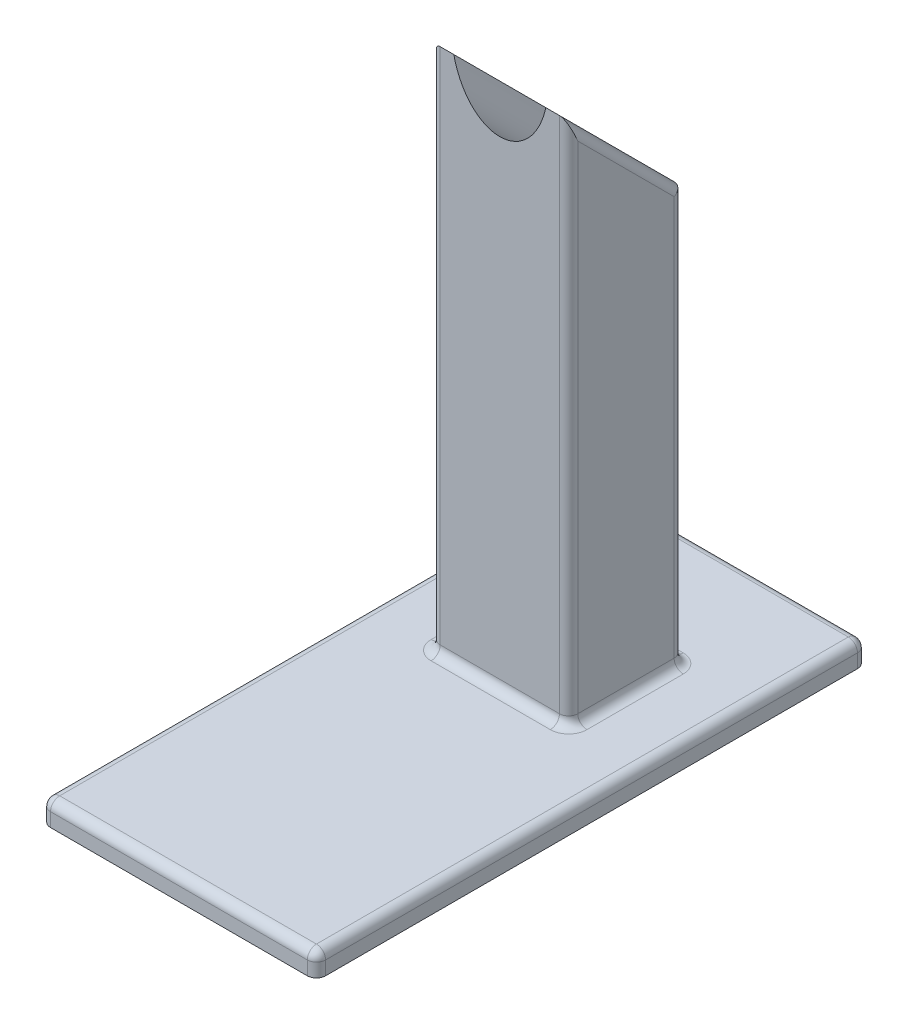
ISO-10303-21;
HEADER;
FILE_DESCRIPTION(('STEP AP214'),'2;1');
FILE_NAME('part.step','',(''),(''),'','','');
FILE_SCHEMA(('AUTOMOTIVE_DESIGN { 1 0 10303 214 1 1 1 1 }'));
ENDSEC;
DATA;
#1=APPLICATION_CONTEXT('core data for automotive mechanical design processes');
#2=APPLICATION_PROTOCOL_DEFINITION('international standard','automotive_design',2000,#1);
#3=PRODUCT_CONTEXT('',#1,'mechanical');
#4=PRODUCT('Part','Part','',(#3));
#5=PRODUCT_RELATED_PRODUCT_CATEGORY('part','',(#4));
#6=PRODUCT_DEFINITION_FORMATION('','',#4);
#7=PRODUCT_DEFINITION_CONTEXT('part definition',#1,'design');
#8=PRODUCT_DEFINITION('design','',#6,#7);
#9=PRODUCT_DEFINITION_SHAPE('','',#8);
#10=(LENGTH_UNIT() NAMED_UNIT(*) SI_UNIT(.MILLI.,.METRE.));
#11=(NAMED_UNIT(*) PLANE_ANGLE_UNIT() SI_UNIT($,.RADIAN.));
#12=(NAMED_UNIT(*) SI_UNIT($,.STERADIAN.) SOLID_ANGLE_UNIT());
#13=UNCERTAINTY_MEASURE_WITH_UNIT(LENGTH_MEASURE(1.E-05),#10,'distance_accuracy_value','');
#14=(GEOMETRIC_REPRESENTATION_CONTEXT(3) GLOBAL_UNCERTAINTY_ASSIGNED_CONTEXT((#13)) GLOBAL_UNIT_ASSIGNED_CONTEXT((#10,
#11,#12)) REPRESENTATION_CONTEXT('',''));
#15=CARTESIAN_POINT('',(0.,0.,0.));
#16=DIRECTION('',(0.,0.,1.));
#17=DIRECTION('',(1.,0.,0.));
#18=AXIS2_PLACEMENT_3D('',#15,#16,#17);
#19=CARTESIAN_POINT('',(-19.05,152.4,-12.7));
#20=DIRECTION('',(0.,-0.707106781186546,0.707106781186549));
#21=DIRECTION('',(0.,-0.707106781186549,-0.707106781186546));
#22=AXIS2_PLACEMENT_3D('',#19,#20,#21);
#23=PLANE('',#22);
#24=DIRECTION('',(1.,0.,0.));
#25=VECTOR('',#24,1.);
#26=CARTESIAN_POINT('',(-19.05,120.65,-44.45));
#27=LINE('',#26,#25);
#28=CARTESIAN_POINT('',(-16.51,120.65,-44.45));
#29=VERTEX_POINT('',#28);
#30=CARTESIAN_POINT('',(-12.7499078891507,120.65,-44.45));
#31=VERTEX_POINT('',#30);
#32=EDGE_CURVE('E200',#29,#31,#27,.T.);
#33=ORIENTED_EDGE('',*,*,#32,.F.);
#34=DIRECTION('',(0.,-0.707106781186549,-0.707106781186546));
#35=VECTOR('',#34,1.);
#36=CARTESIAN_POINT('',(-16.51,152.4,-12.7));
#37=LINE('',#36,#35);
#38=CARTESIAN_POINT('',(-16.51,152.4,-12.7));
#39=VERTEX_POINT('',#38);
#40=EDGE_CURVE('E327',#29,#39,#37,.F.);
#41=ORIENTED_EDGE('',*,*,#40,.T.);
#42=DIRECTION('',(1.,0.,0.));
#43=VECTOR('',#42,1.);
#44=CARTESIAN_POINT('',(-19.05,152.4,-12.7));
#45=LINE('',#44,#43);
#46=CARTESIAN_POINT('',(-12.7499078891507,152.4,-12.7));
#47=VERTEX_POINT('',#46);
#48=EDGE_CURVE('E225',#39,#47,#45,.T.);
#49=ORIENTED_EDGE('',*,*,#48,.T.);
#50=DIRECTION('',(0.,-0.707106781186549,-0.707106781186546));
#51=VECTOR('',#50,1.);
#52=CARTESIAN_POINT('',(-12.7499078891507,196.85,31.7499999999999));
#53=LINE('',#52,#51);
#54=EDGE_CURVE('E218',#31,#47,#53,.F.);
#55=ORIENTED_EDGE('',*,*,#54,.F.);
#56=EDGE_LOOP('',(#33,#41,#49,#55));
#57=FACE_BOUND('',#56,.T.);
#58=ADVANCED_FACE('F38',(#57),#23,.F.);
#59=CARTESIAN_POINT('',(12.7499078891507,152.4,-12.7));
#60=VERTEX_POINT('',#59);
#61=CARTESIAN_POINT('',(16.51,152.4,-12.7));
#62=VERTEX_POINT('',#61);
#63=EDGE_CURVE('E212',#60,#62,#45,.T.);
#64=ORIENTED_EDGE('',*,*,#63,.T.);
#65=DIRECTION('',(0.,-0.707106781186549,-0.707106781186546));
#66=VECTOR('',#65,1.);
#67=CARTESIAN_POINT('',(16.51,152.4,-12.7));
#68=LINE('',#67,#66);
#69=CARTESIAN_POINT('',(16.51,120.65,-44.45));
#70=VERTEX_POINT('',#69);
#71=EDGE_CURVE('E325',#62,#70,#68,.T.);
#72=ORIENTED_EDGE('',*,*,#71,.T.);
#73=CARTESIAN_POINT('',(12.7499078891507,120.65,-44.45));
#74=VERTEX_POINT('',#73);
#75=EDGE_CURVE('E213',#74,#70,#27,.T.);
#76=ORIENTED_EDGE('',*,*,#75,.F.);
#77=DIRECTION('',(0.,-0.707106781186549,-0.707106781186546));
#78=VECTOR('',#77,1.);
#79=CARTESIAN_POINT('',(12.7499078891507,196.85,31.7499999999999));
#80=LINE('',#79,#78);
#81=EDGE_CURVE('E221',#60,#74,#80,.T.);
#82=ORIENTED_EDGE('',*,*,#81,.F.);
#83=EDGE_LOOP('',(#64,#72,#76,#82));
#84=FACE_BOUND('',#83,.T.);
#85=ADVANCED_FACE('F454',(#84),#23,.F.);
#86=CARTESIAN_POINT('',(38.1,6.35,76.2));
#87=DIRECTION('',(-1.,0.,0.));
#88=DIRECTION('',(0.,0.,1.));
#89=AXIS2_PLACEMENT_3D('',#86,#87,#88);
#90=PLANE('',#89);
#91=DIRECTION('',(0.,0.,-1.));
#92=VECTOR('',#91,1.);
#93=CARTESIAN_POINT('',(38.1,0.,76.2));
#94=LINE('',#93,#92);
#95=CARTESIAN_POINT('',(38.1,0.,73.66));
#96=VERTEX_POINT('',#95);
#97=CARTESIAN_POINT('',(38.1,0.,-73.6599999999999));
#98=VERTEX_POINT('',#97);
#99=EDGE_CURVE('E232',#96,#98,#94,.T.);
#100=ORIENTED_EDGE('',*,*,#99,.T.);
#101=DIRECTION('',(0.,-1.,0.));
#102=VECTOR('',#101,1.);
#103=CARTESIAN_POINT('',(38.1,6.35,-73.66));
#104=LINE('',#103,#102);
#105=CARTESIAN_POINT('',(38.1,3.81,-73.66));
#106=VERTEX_POINT('',#105);
#107=EDGE_CURVE('E296',#98,#106,#104,.F.);
#108=ORIENTED_EDGE('',*,*,#107,.T.);
#109=DIRECTION('',(0.,0.,-1.));
#110=VECTOR('',#109,1.);
#111=CARTESIAN_POINT('',(38.1,3.81,76.2));
#112=LINE('',#111,#110);
#113=CARTESIAN_POINT('',(38.1,3.81,73.66));
#114=VERTEX_POINT('',#113);
#115=EDGE_CURVE('E294',#106,#114,#112,.F.);
#116=ORIENTED_EDGE('',*,*,#115,.T.);
#117=DIRECTION('',(0.,-1.,0.));
#118=VECTOR('',#117,1.);
#119=CARTESIAN_POINT('',(38.1,6.35,73.66));
#120=LINE('',#119,#118);
#121=EDGE_CURVE('E292',#114,#96,#120,.T.);
#122=ORIENTED_EDGE('',*,*,#121,.T.);
#123=EDGE_LOOP('',(#100,#108,#116,#122));
#124=FACE_BOUND('',#123,.T.);
#125=ADVANCED_FACE('F491',(#124),#90,.F.);
#126=CARTESIAN_POINT('',(-38.1,6.35,-76.2));
#127=DIRECTION('',(0.,0.,1.));
#128=DIRECTION('',(1.,0.,0.));
#129=AXIS2_PLACEMENT_3D('',#126,#127,#128);
#130=PLANE('',#129);
#131=DIRECTION('',(-1.,0.,0.));
#132=VECTOR('',#131,1.);
#133=CARTESIAN_POINT('',(-38.1,0.,-76.2));
#134=LINE('',#133,#132);
#135=CARTESIAN_POINT('',(35.56,0.,-76.2));
#136=VERTEX_POINT('',#135);
#137=CARTESIAN_POINT('',(-35.56,0.,-76.2));
#138=VERTEX_POINT('',#137);
#139=EDGE_CURVE('E236',#136,#138,#134,.T.);
#140=ORIENTED_EDGE('',*,*,#139,.T.);
#141=DIRECTION('',(0.,-1.,0.));
#142=VECTOR('',#141,1.);
#143=CARTESIAN_POINT('',(-35.56,6.35,-76.2));
#144=LINE('',#143,#142);
#145=CARTESIAN_POINT('',(-35.56,3.81,-76.2));
#146=VERTEX_POINT('',#145);
#147=EDGE_CURVE('E290',#138,#146,#144,.F.);
#148=ORIENTED_EDGE('',*,*,#147,.T.);
#149=DIRECTION('',(-1.,0.,0.));
#150=VECTOR('',#149,1.);
#151=CARTESIAN_POINT('',(-38.1,3.81,-76.2));
#152=LINE('',#151,#150);
#153=CARTESIAN_POINT('',(35.56,3.81,-76.2));
#154=VERTEX_POINT('',#153);
#155=EDGE_CURVE('E288',#146,#154,#152,.F.);
#156=ORIENTED_EDGE('',*,*,#155,.T.);
#157=DIRECTION('',(0.,-1.,0.));
#158=VECTOR('',#157,1.);
#159=CARTESIAN_POINT('',(35.56,6.35,-76.2));
#160=LINE('',#159,#158);
#161=EDGE_CURVE('E286',#154,#136,#160,.T.);
#162=ORIENTED_EDGE('',*,*,#161,.T.);
#163=EDGE_LOOP('',(#140,#148,#156,#162));
#164=FACE_BOUND('',#163,.T.);
#165=ADVANCED_FACE('F510',(#164),#130,.F.);
#166=CARTESIAN_POINT('',(-38.1,6.35,76.2));
#167=DIRECTION('',(1.,0.,0.));
#168=DIRECTION('',(0.,0.,-1.));
#169=AXIS2_PLACEMENT_3D('',#166,#167,#168);
#170=PLANE('',#169);
#171=DIRECTION('',(0.,0.,1.));
#172=VECTOR('',#171,1.);
#173=CARTESIAN_POINT('',(-38.1,0.,76.2));
#174=LINE('',#173,#172);
#175=CARTESIAN_POINT('',(-38.1,0.,-73.6599999999999));
#176=VERTEX_POINT('',#175);
#177=CARTESIAN_POINT('',(-38.1,0.,73.66));
#178=VERTEX_POINT('',#177);
#179=EDGE_CURVE('E239',#176,#178,#174,.T.);
#180=ORIENTED_EDGE('',*,*,#179,.T.);
#181=DIRECTION('',(0.,-1.,0.));
#182=VECTOR('',#181,1.);
#183=CARTESIAN_POINT('',(-38.1,6.35,73.66));
#184=LINE('',#183,#182);
#185=CARTESIAN_POINT('',(-38.1,3.81,73.66));
#186=VERTEX_POINT('',#185);
#187=EDGE_CURVE('E284',#178,#186,#184,.F.);
#188=ORIENTED_EDGE('',*,*,#187,.T.);
#189=DIRECTION('',(0.,0.,1.));
#190=VECTOR('',#189,1.);
#191=CARTESIAN_POINT('',(-38.1,3.81,76.2));
#192=LINE('',#191,#190);
#193=CARTESIAN_POINT('',(-38.1,3.81,-73.66));
#194=VERTEX_POINT('',#193);
#195=EDGE_CURVE('E282',#186,#194,#192,.F.);
#196=ORIENTED_EDGE('',*,*,#195,.T.);
#197=DIRECTION('',(0.,-1.,0.));
#198=VECTOR('',#197,1.);
#199=CARTESIAN_POINT('',(-38.1,6.35,-73.66));
#200=LINE('',#199,#198);
#201=EDGE_CURVE('E280',#194,#176,#200,.T.);
#202=ORIENTED_EDGE('',*,*,#201,.T.);
#203=EDGE_LOOP('',(#180,#188,#196,#202));
#204=FACE_BOUND('',#203,.T.);
#205=ADVANCED_FACE('F506',(#204),#170,.F.);
#206=CARTESIAN_POINT('',(-38.1,6.35,76.2));
#207=DIRECTION('',(0.,0.,-1.));
#208=DIRECTION('',(-1.,0.,0.));
#209=AXIS2_PLACEMENT_3D('',#206,#207,#208);
#210=PLANE('',#209);
#211=DIRECTION('',(1.,0.,0.));
#212=VECTOR('',#211,1.);
#213=CARTESIAN_POINT('',(-38.1,3.81,76.2));
#214=LINE('',#213,#212);
#215=CARTESIAN_POINT('',(35.56,3.81,76.2));
#216=VERTEX_POINT('',#215);
#217=CARTESIAN_POINT('',(-35.56,3.81,76.2));
#218=VERTEX_POINT('',#217);
#219=EDGE_CURVE('E275',#216,#218,#214,.F.);
#220=ORIENTED_EDGE('',*,*,#219,.T.);
#221=DIRECTION('',(0.,-1.,0.));
#222=VECTOR('',#221,1.);
#223=CARTESIAN_POINT('',(-35.56,6.35,76.2));
#224=LINE('',#223,#222);
#225=CARTESIAN_POINT('',(-35.56,0.,76.2));
#226=VERTEX_POINT('',#225);
#227=EDGE_CURVE('E278',#218,#226,#224,.T.);
#228=ORIENTED_EDGE('',*,*,#227,.T.);
#229=DIRECTION('',(1.,0.,0.));
#230=VECTOR('',#229,1.);
#231=CARTESIAN_POINT('',(-38.1,0.,76.2));
#232=LINE('',#231,#230);
#233=CARTESIAN_POINT('',(35.56,0.,76.2));
#234=VERTEX_POINT('',#233);
#235=EDGE_CURVE('E223',#226,#234,#232,.T.);
#236=ORIENTED_EDGE('',*,*,#235,.T.);
#237=DIRECTION('',(0.,-1.,0.));
#238=VECTOR('',#237,1.);
#239=CARTESIAN_POINT('',(35.56,6.35,76.2));
#240=LINE('',#239,#238);
#241=EDGE_CURVE('E273',#234,#216,#240,.F.);
#242=ORIENTED_EDGE('',*,*,#241,.T.);
#243=EDGE_LOOP('',(#220,#228,#236,#242));
#244=FACE_BOUND('',#243,.T.);
#245=ADVANCED_FACE('F499',(#244),#210,.F.);
#246=CARTESIAN_POINT('',(0.,6.35,0.));
#247=DIRECTION('',(0.,-1.,0.));
#248=DIRECTION('',(0.,0.,-1.));
#249=AXIS2_PLACEMENT_3D('',#246,#247,#248);
#250=PLANE('',#249);
#251=DIRECTION('',(0.,0.,1.));
#252=VECTOR('',#251,1.);
#253=CARTESIAN_POINT('',(-35.56,6.35,0.));
#254=LINE('',#253,#252);
#255=CARTESIAN_POINT('',(-35.56,6.35,-73.66));
#256=VERTEX_POINT('',#255);
#257=CARTESIAN_POINT('',(-35.56,6.35,73.66));
#258=VERTEX_POINT('',#257);
#259=EDGE_CURVE('E268',#256,#258,#254,.T.);
#260=ORIENTED_EDGE('',*,*,#259,.T.);
#261=DIRECTION('',(1.,0.,0.));
#262=VECTOR('',#261,1.);
#263=CARTESIAN_POINT('',(0.,6.35,73.66));
#264=LINE('',#263,#262);
#265=CARTESIAN_POINT('',(35.56,6.35,73.66));
#266=VERTEX_POINT('',#265);
#267=EDGE_CURVE('E270',#258,#266,#264,.T.);
#268=ORIENTED_EDGE('',*,*,#267,.T.);
#269=DIRECTION('',(0.,0.,-1.));
#270=VECTOR('',#269,1.);
#271=CARTESIAN_POINT('',(35.56,6.35,0.));
#272=LINE('',#271,#270);
#273=CARTESIAN_POINT('',(35.56,6.35,-73.66));
#274=VERTEX_POINT('',#273);
#275=EDGE_CURVE('E264',#266,#274,#272,.T.);
#276=ORIENTED_EDGE('',*,*,#275,.T.);
#277=DIRECTION('',(-1.,0.,0.));
#278=VECTOR('',#277,1.);
#279=CARTESIAN_POINT('',(0.,6.35,-73.66));
#280=LINE('',#279,#278);
#281=EDGE_CURVE('E266',#274,#256,#280,.T.);
#282=ORIENTED_EDGE('',*,*,#281,.T.);
#283=EDGE_LOOP('',(#260,#268,#276,#282));
#284=FACE_BOUND('',#283,.T.);
#285=CARTESIAN_POINT('',(-16.51,6.35,-41.91));
#286=DIRECTION('',(0.,-1.,0.));
#287=DIRECTION('',(0.,0.,-1.));
#288=AXIS2_PLACEMENT_3D('',#285,#286,#287);
#289=CIRCLE('',#288,5.08);
#290=CARTESIAN_POINT('',(-16.51,6.35,-46.99));
#291=VERTEX_POINT('',#290);
#292=CARTESIAN_POINT('',(-21.59,6.35,-41.91));
#293=VERTEX_POINT('',#292);
#294=EDGE_CURVE('E256',#291,#293,#289,.F.);
#295=ORIENTED_EDGE('',*,*,#294,.F.);
#296=DIRECTION('',(1.,0.,0.));
#297=VECTOR('',#296,1.);
#298=CARTESIAN_POINT('',(19.05,6.35,-46.99));
#299=LINE('',#298,#297);
#300=CARTESIAN_POINT('',(16.51,6.35,-46.99));
#301=VERTEX_POINT('',#300);
#302=EDGE_CURVE('E262',#291,#301,#299,.T.);
#303=ORIENTED_EDGE('',*,*,#302,.T.);
#304=CARTESIAN_POINT('',(16.51,6.35,-41.91));
#305=DIRECTION('',(0.,-1.,0.));
#306=DIRECTION('',(0.,0.,-1.));
#307=AXIS2_PLACEMENT_3D('',#304,#305,#306);
#308=CIRCLE('',#307,5.08);
#309=CARTESIAN_POINT('',(21.59,6.35,-41.91));
#310=VERTEX_POINT('',#309);
#311=EDGE_CURVE('E259',#310,#301,#308,.F.);
#312=ORIENTED_EDGE('',*,*,#311,.F.);
#313=DIRECTION('',(0.,0.,-1.));
#314=VECTOR('',#313,1.);
#315=CARTESIAN_POINT('',(21.59,6.35,-12.7));
#316=LINE('',#315,#314);
#317=CARTESIAN_POINT('',(21.59,6.35,-15.24));
#318=VERTEX_POINT('',#317);
#319=EDGE_CURVE('E253',#310,#318,#316,.F.);
#320=ORIENTED_EDGE('',*,*,#319,.T.);
#321=CARTESIAN_POINT('',(16.51,6.35,-15.24));
#322=DIRECTION('',(0.,-1.,0.));
#323=DIRECTION('',(0.,0.,-1.));
#324=AXIS2_PLACEMENT_3D('',#321,#322,#323);
#325=CIRCLE('',#324,5.08);
#326=CARTESIAN_POINT('',(16.51,6.35,-10.16));
#327=VERTEX_POINT('',#326);
#328=EDGE_CURVE('E250',#327,#318,#325,.F.);
#329=ORIENTED_EDGE('',*,*,#328,.F.);
#330=DIRECTION('',(1.,0.,0.));
#331=VECTOR('',#330,1.);
#332=CARTESIAN_POINT('',(-19.05,6.35,-10.16));
#333=LINE('',#332,#331);
#334=CARTESIAN_POINT('',(-16.51,6.35,-10.16));
#335=VERTEX_POINT('',#334);
#336=EDGE_CURVE('E246',#327,#335,#333,.F.);
#337=ORIENTED_EDGE('',*,*,#336,.T.);
#338=CARTESIAN_POINT('',(-16.51,6.35,-15.24));
#339=DIRECTION('',(0.,-1.,0.));
#340=DIRECTION('',(0.,0.,-1.));
#341=AXIS2_PLACEMENT_3D('',#338,#339,#340);
#342=CIRCLE('',#341,5.08);
#343=CARTESIAN_POINT('',(-21.59,6.35,-15.24));
#344=VERTEX_POINT('',#343);
#345=EDGE_CURVE('E222',#344,#335,#342,.F.);
#346=ORIENTED_EDGE('',*,*,#345,.F.);
#347=DIRECTION('',(0.,0.,-1.));
#348=VECTOR('',#347,1.);
#349=CARTESIAN_POINT('',(-21.59,6.35,0.));
#350=LINE('',#349,#348);
#351=EDGE_CURVE('E248',#344,#293,#350,.T.);
#352=ORIENTED_EDGE('',*,*,#351,.T.);
#353=EDGE_LOOP('',(#295,#303,#312,#320,#329,#337,#346,#352));
#354=FACE_BOUND('',#353,.T.);
#355=ADVANCED_FACE('F431',(#284,#354),#250,.F.);
#356=CARTESIAN_POINT('',(0.,0.,0.));
#357=DIRECTION('',(0.,-1.,0.));
#358=DIRECTION('',(0.,0.,-1.));
#359=AXIS2_PLACEMENT_3D('',#356,#357,#358);
#360=PLANE('',#359);
#361=ORIENTED_EDGE('',*,*,#235,.F.);
#362=CARTESIAN_POINT('',(-35.56,0.,73.66));
#363=DIRECTION('',(0.,-1.,0.));
#364=DIRECTION('',(0.,0.,-1.));
#365=AXIS2_PLACEMENT_3D('',#362,#363,#364);
#366=CIRCLE('',#365,2.54);
#367=EDGE_CURVE('E11',#226,#178,#366,.T.);
#368=ORIENTED_EDGE('',*,*,#367,.T.);
#369=ORIENTED_EDGE('',*,*,#179,.F.);
#370=CARTESIAN_POINT('',(-35.56,0.,-73.66));
#371=DIRECTION('',(0.,-1.,0.));
#372=DIRECTION('',(0.,0.,-1.));
#373=AXIS2_PLACEMENT_3D('',#370,#371,#372);
#374=CIRCLE('',#373,2.54);
#375=EDGE_CURVE('E47',#176,#138,#374,.T.);
#376=ORIENTED_EDGE('',*,*,#375,.T.);
#377=ORIENTED_EDGE('',*,*,#139,.F.);
#378=CARTESIAN_POINT('',(35.56,0.,-73.66));
#379=DIRECTION('',(0.,-1.,0.));
#380=DIRECTION('',(0.,0.,-1.));
#381=AXIS2_PLACEMENT_3D('',#378,#379,#380);
#382=CIRCLE('',#381,2.54);
#383=EDGE_CURVE('E331',#136,#98,#382,.T.);
#384=ORIENTED_EDGE('',*,*,#383,.T.);
#385=ORIENTED_EDGE('',*,*,#99,.F.);
#386=CARTESIAN_POINT('',(35.56,0.,73.66));
#387=DIRECTION('',(0.,-1.,0.));
#388=DIRECTION('',(0.,0.,-1.));
#389=AXIS2_PLACEMENT_3D('',#386,#387,#388);
#390=CIRCLE('',#389,2.54);
#391=EDGE_CURVE('E329',#96,#234,#390,.T.);
#392=ORIENTED_EDGE('',*,*,#391,.T.);
#393=EDGE_LOOP('',(#361,#368,#369,#376,#377,#384,#385,#392));
#394=FACE_BOUND('',#393,.T.);
#395=ADVANCED_FACE('F498',(#394),#360,.T.);
#396=CARTESIAN_POINT('',(-19.05,6.35,-12.7));
#397=DIRECTION('',(0.,0.,-1.));
#398=DIRECTION('',(0.,1.,0.));
#399=AXIS2_PLACEMENT_3D('',#396,#397,#398);
#400=PLANE('',#399);
#401=DIRECTION('',(1.,0.,0.));
#402=VECTOR('',#401,1.);
#403=CARTESIAN_POINT('',(19.05,8.89,-12.7));
#404=LINE('',#403,#402);
#405=CARTESIAN_POINT('',(-16.51,8.89,-12.7));
#406=VERTEX_POINT('',#405);
#407=CARTESIAN_POINT('',(16.51,8.89,-12.7));
#408=VERTEX_POINT('',#407);
#409=EDGE_CURVE('E55',#406,#408,#404,.T.);
#410=ORIENTED_EDGE('',*,*,#409,.T.);
#411=DIRECTION('',(0.,1.,0.));
#412=VECTOR('',#411,1.);
#413=CARTESIAN_POINT('',(16.51,6.35,-12.7));
#414=LINE('',#413,#412);
#415=EDGE_CURVE('E323',#408,#62,#414,.T.);
#416=ORIENTED_EDGE('',*,*,#415,.T.);
#417=ORIENTED_EDGE('',*,*,#63,.F.);
#418=CARTESIAN_POINT('',(0.,157.924866300314,-12.7));
#419=DIRECTION('',(0.,0.,-1.));
#420=DIRECTION('',(0.,-1.,0.));
#421=AXIS2_PLACEMENT_3D('',#418,#419,#420);
#422=ELLIPSE('',#421,18.8585378542453,13.335);
#423=EDGE_CURVE('E226',#47,#60,#422,.F.);
#424=ORIENTED_EDGE('',*,*,#423,.F.);
#425=ORIENTED_EDGE('',*,*,#48,.F.);
#426=DIRECTION('',(0.,1.,0.));
#427=VECTOR('',#426,1.);
#428=CARTESIAN_POINT('',(-16.51,6.35,-12.7));
#429=LINE('',#428,#427);
#430=EDGE_CURVE('E60',#39,#406,#429,.F.);
#431=ORIENTED_EDGE('',*,*,#430,.T.);
#432=EDGE_LOOP('',(#410,#416,#417,#424,#425,#431));
#433=FACE_BOUND('',#432,.T.);
#434=ADVANCED_FACE('F451',(#433),#400,.F.);
#435=CARTESIAN_POINT('',(-19.05,120.65,-44.45));
#436=DIRECTION('',(0.,0.,1.));
#437=DIRECTION('',(0.,-1.,0.));
#438=AXIS2_PLACEMENT_3D('',#435,#436,#437);
#439=PLANE('',#438);
#440=ORIENTED_EDGE('',*,*,#75,.T.);
#441=DIRECTION('',(0.,-1.,0.));
#442=VECTOR('',#441,1.);
#443=CARTESIAN_POINT('',(16.51,120.65,-44.45));
#444=LINE('',#443,#442);
#445=CARTESIAN_POINT('',(16.51,8.89,-44.45));
#446=VERTEX_POINT('',#445);
#447=EDGE_CURVE('E310',#70,#446,#444,.T.);
#448=ORIENTED_EDGE('',*,*,#447,.T.);
#449=DIRECTION('',(1.,0.,0.));
#450=VECTOR('',#449,1.);
#451=CARTESIAN_POINT('',(-19.05,8.89,-44.45));
#452=LINE('',#451,#450);
#453=CARTESIAN_POINT('',(-16.51,8.89,-44.45));
#454=VERTEX_POINT('',#453);
#455=EDGE_CURVE('E308',#446,#454,#452,.F.);
#456=ORIENTED_EDGE('',*,*,#455,.T.);
#457=DIRECTION('',(0.,-1.,0.));
#458=VECTOR('',#457,1.);
#459=CARTESIAN_POINT('',(-16.51,120.65,-44.45));
#460=LINE('',#459,#458);
#461=EDGE_CURVE('E208',#454,#29,#460,.F.);
#462=ORIENTED_EDGE('',*,*,#461,.T.);
#463=ORIENTED_EDGE('',*,*,#32,.T.);
#464=CARTESIAN_POINT('',(0.,126.174866300314,-44.45));
#465=DIRECTION('',(0.,0.,1.));
#466=DIRECTION('',(0.,-1.,0.));
#467=AXIS2_PLACEMENT_3D('',#464,#465,#466);
#468=ELLIPSE('',#467,18.8585378542453,13.335);
#469=EDGE_CURVE('E204',#74,#31,#468,.F.);
#470=ORIENTED_EDGE('',*,*,#469,.F.);
#471=EDGE_LOOP('',(#440,#448,#456,#462,#463,#470));
#472=FACE_BOUND('',#471,.T.);
#473=ADVANCED_FACE('F203',(#472),#439,.F.);
#474=CARTESIAN_POINT('',(-19.05,0.,0.));
#475=DIRECTION('',(-1.,0.,0.));
#476=DIRECTION('',(0.,0.,1.));
#477=AXIS2_PLACEMENT_3D('',#474,#475,#476);
#478=PLANE('',#477);
#479=DIRECTION('',(0.,-0.707106781186549,-0.707106781186546));
#480=VECTOR('',#479,1.);
#481=CARTESIAN_POINT('',(-19.05,118.853948775786,-42.6539487757861));
#482=LINE('',#481,#480);
#483=CARTESIAN_POINT('',(-19.05,146.267897551572,-15.24));
#484=VERTEX_POINT('',#483);
#485=CARTESIAN_POINT('',(-19.05,119.597897551572,-41.91));
#486=VERTEX_POINT('',#485);
#487=EDGE_CURVE('E314',#484,#486,#482,.T.);
#488=ORIENTED_EDGE('',*,*,#487,.T.);
#489=DIRECTION('',(0.,-1.,0.));
#490=VECTOR('',#489,1.);
#491=CARTESIAN_POINT('',(-19.05,6.35,-41.91));
#492=LINE('',#491,#490);
#493=CARTESIAN_POINT('',(-19.05,8.89,-41.91));
#494=VERTEX_POINT('',#493);
#495=EDGE_CURVE('E319',#486,#494,#492,.T.);
#496=ORIENTED_EDGE('',*,*,#495,.T.);
#497=DIRECTION('',(0.,0.,-1.));
#498=VECTOR('',#497,1.);
#499=CARTESIAN_POINT('',(-19.05,8.89,0.));
#500=LINE('',#499,#498);
#501=CARTESIAN_POINT('',(-19.05,8.89,-15.24));
#502=VERTEX_POINT('',#501);
#503=EDGE_CURVE('E316',#494,#502,#500,.F.);
#504=ORIENTED_EDGE('',*,*,#503,.T.);
#505=DIRECTION('',(0.,1.,0.));
#506=VECTOR('',#505,1.);
#507=CARTESIAN_POINT('',(-19.05,152.4,-15.24));
#508=LINE('',#507,#506);
#509=EDGE_CURVE('E312',#502,#484,#508,.T.);
#510=ORIENTED_EDGE('',*,*,#509,.T.);
#511=EDGE_LOOP('',(#488,#496,#504,#510));
#512=FACE_BOUND('',#511,.T.);
#513=ADVANCED_FACE('F417',(#512),#478,.T.);
#514=CARTESIAN_POINT('',(19.05,0.,0.));
#515=DIRECTION('',(-1.,0.,0.));
#516=DIRECTION('',(0.,0.,1.));
#517=AXIS2_PLACEMENT_3D('',#514,#515,#516);
#518=PLANE('',#517);
#519=DIRECTION('',(0.,0.,-1.));
#520=VECTOR('',#519,1.);
#521=CARTESIAN_POINT('',(19.05,8.89,-44.45));
#522=LINE('',#521,#520);
#523=CARTESIAN_POINT('',(19.05,8.89,-15.24));
#524=VERTEX_POINT('',#523);
#525=CARTESIAN_POINT('',(19.05,8.89,-41.91));
#526=VERTEX_POINT('',#525);
#527=EDGE_CURVE('E302',#524,#526,#522,.T.);
#528=ORIENTED_EDGE('',*,*,#527,.T.);
#529=DIRECTION('',(0.,-1.,0.));
#530=VECTOR('',#529,1.);
#531=CARTESIAN_POINT('',(19.05,0.,-41.91));
#532=LINE('',#531,#530);
#533=CARTESIAN_POINT('',(19.05,119.597897551572,-41.91));
#534=VERTEX_POINT('',#533);
#535=EDGE_CURVE('E305',#526,#534,#532,.F.);
#536=ORIENTED_EDGE('',*,*,#535,.T.);
#537=DIRECTION('',(0.,-0.707106781186549,-0.707106781186546));
#538=VECTOR('',#537,1.);
#539=CARTESIAN_POINT('',(19.05,80.753948775786,-80.7539487757862));
#540=LINE('',#539,#538);
#541=CARTESIAN_POINT('',(19.05,146.267897551572,-15.24));
#542=VERTEX_POINT('',#541);
#543=EDGE_CURVE('E300',#534,#542,#540,.F.);
#544=ORIENTED_EDGE('',*,*,#543,.T.);
#545=DIRECTION('',(0.,1.,0.));
#546=VECTOR('',#545,1.);
#547=CARTESIAN_POINT('',(19.05,0.,-15.24));
#548=LINE('',#547,#546);
#549=EDGE_CURVE('E298',#542,#524,#548,.F.);
#550=ORIENTED_EDGE('',*,*,#549,.T.);
#551=EDGE_LOOP('',(#528,#536,#544,#550));
#552=FACE_BOUND('',#551,.T.);
#553=ADVANCED_FACE('F474',(#552),#518,.F.);
#554=CARTESIAN_POINT('',(0.,199.612433150157,28.9875668498429));
#555=DIRECTION('',(0.,-0.707106781186549,-0.707106781186546));
#556=DIRECTION('',(0.,0.707106781186546,-0.707106781186549));
#557=AXIS2_PLACEMENT_3D('',#554,#555,#556);
#558=CYLINDRICAL_SURFACE('',#557,13.335);
#559=ORIENTED_EDGE('',*,*,#423,.T.);
#560=ORIENTED_EDGE('',*,*,#81,.T.);
#561=ORIENTED_EDGE('',*,*,#469,.T.);
#562=ORIENTED_EDGE('',*,*,#54,.T.);
#563=EDGE_LOOP('',(#559,#560,#561,#562));
#564=FACE_BOUND('',#563,.T.);
#565=ADVANCED_FACE('F217',(#564),#558,.F.);
#566=CARTESIAN_POINT('',(-35.56,6.35,-73.66));
#567=DIRECTION('',(0.,-1.,0.));
#568=DIRECTION('',(0.,0.,-1.));
#569=AXIS2_PLACEMENT_3D('',#566,#567,#568);
#570=CYLINDRICAL_SURFACE('',#569,2.54);
#571=ORIENTED_EDGE('',*,*,#375,.F.);
#572=ORIENTED_EDGE('',*,*,#201,.F.);
#573=CARTESIAN_POINT('',(-35.56,3.81,-73.66));
#574=DIRECTION('',(0.,1.,0.));
#575=DIRECTION('',(0.,0.,1.));
#576=AXIS2_PLACEMENT_3D('',#573,#574,#575);
#577=CIRCLE('',#576,2.54);
#578=EDGE_CURVE('E229',#146,#194,#577,.T.);
#579=ORIENTED_EDGE('',*,*,#578,.F.);
#580=ORIENTED_EDGE('',*,*,#147,.F.);
#581=EDGE_LOOP('',(#571,#572,#579,#580));
#582=FACE_BOUND('',#581,.T.);
#583=ADVANCED_FACE('F482',(#582),#570,.T.);
#584=CARTESIAN_POINT('',(0.,3.81,-73.66));
#585=DIRECTION('',(-1.,0.,0.));
#586=DIRECTION('',(0.,0.,1.));
#587=AXIS2_PLACEMENT_3D('',#584,#585,#586);
#588=CYLINDRICAL_SURFACE('',#587,2.54);
#589=CARTESIAN_POINT('',(35.56,3.81,-73.66));
#590=DIRECTION('',(1.,0.,0.));
#591=DIRECTION('',(0.,0.,-1.));
#592=AXIS2_PLACEMENT_3D('',#589,#590,#591);
#593=CIRCLE('',#592,2.54);
#594=EDGE_CURVE('E359',#154,#274,#593,.T.);
#595=ORIENTED_EDGE('',*,*,#594,.F.);
#596=ORIENTED_EDGE('',*,*,#155,.F.);
#597=CARTESIAN_POINT('',(-35.56,3.81,-73.66));
#598=DIRECTION('',(-1.,0.,0.));
#599=DIRECTION('',(0.,0.,1.));
#600=AXIS2_PLACEMENT_3D('',#597,#598,#599);
#601=CIRCLE('',#600,2.54);
#602=EDGE_CURVE('E362',#256,#146,#601,.T.);
#603=ORIENTED_EDGE('',*,*,#602,.F.);
#604=ORIENTED_EDGE('',*,*,#281,.F.);
#605=EDGE_LOOP('',(#595,#596,#603,#604));
#606=FACE_BOUND('',#605,.T.);
#607=ADVANCED_FACE('F557',(#606),#588,.T.);
#608=CARTESIAN_POINT('',(35.56,6.35,-73.66));
#609=DIRECTION('',(0.,-1.,0.));
#610=DIRECTION('',(0.,0.,-1.));
#611=AXIS2_PLACEMENT_3D('',#608,#609,#610);
#612=CYLINDRICAL_SURFACE('',#611,2.54);
#613=ORIENTED_EDGE('',*,*,#383,.F.);
#614=ORIENTED_EDGE('',*,*,#161,.F.);
#615=CARTESIAN_POINT('',(35.56,3.81,-73.66));
#616=DIRECTION('',(0.,1.,0.));
#617=DIRECTION('',(0.,0.,1.));
#618=AXIS2_PLACEMENT_3D('',#615,#616,#617);
#619=CIRCLE('',#618,2.54);
#620=EDGE_CURVE('E356',#106,#154,#619,.T.);
#621=ORIENTED_EDGE('',*,*,#620,.F.);
#622=ORIENTED_EDGE('',*,*,#107,.F.);
#623=EDGE_LOOP('',(#613,#614,#621,#622));
#624=FACE_BOUND('',#623,.T.);
#625=ADVANCED_FACE('F553',(#624),#612,.T.);
#626=CARTESIAN_POINT('',(-35.56,3.81,-73.66));
#627=DIRECTION('',(0.,0.,1.));
#628=DIRECTION('',(1.,0.,0.));
#629=AXIS2_PLACEMENT_3D('',#626,#627,#628);
#630=SPHERICAL_SURFACE('',#629,2.54);
#631=ORIENTED_EDGE('',*,*,#602,.T.);
#632=ORIENTED_EDGE('',*,*,#578,.T.);
#633=CARTESIAN_POINT('',(-35.56,3.81,-73.66));
#634=DIRECTION('',(0.,0.,-1.));
#635=DIRECTION('',(0.,1.,0.));
#636=AXIS2_PLACEMENT_3D('',#633,#634,#635);
#637=CIRCLE('',#636,2.54);
#638=EDGE_CURVE('E353',#256,#194,#637,.F.);
#639=ORIENTED_EDGE('',*,*,#638,.F.);
#640=EDGE_LOOP('',(#631,#632,#639));
#641=FACE_BOUND('',#640,.T.);
#642=ADVANCED_FACE('F549',(#641),#630,.T.);
#643=CARTESIAN_POINT('',(35.56,3.81,-73.66));
#644=DIRECTION('',(0.,0.,1.));
#645=DIRECTION('',(1.,0.,0.));
#646=AXIS2_PLACEMENT_3D('',#643,#644,#645);
#647=SPHERICAL_SURFACE('',#646,2.54);
#648=ORIENTED_EDGE('',*,*,#620,.T.);
#649=ORIENTED_EDGE('',*,*,#594,.T.);
#650=CARTESIAN_POINT('',(35.56,3.81,-73.66));
#651=DIRECTION('',(0.,0.,-1.));
#652=DIRECTION('',(-1.,0.,0.));
#653=AXIS2_PLACEMENT_3D('',#650,#651,#652);
#654=CIRCLE('',#653,2.54);
#655=EDGE_CURVE('E350',#106,#274,#654,.F.);
#656=ORIENTED_EDGE('',*,*,#655,.F.);
#657=EDGE_LOOP('',(#648,#649,#656));
#658=FACE_BOUND('',#657,.T.);
#659=ADVANCED_FACE('F545',(#658),#647,.T.);
#660=CARTESIAN_POINT('',(-35.56,6.35,73.66));
#661=DIRECTION('',(0.,-1.,0.));
#662=DIRECTION('',(0.,0.,-1.));
#663=AXIS2_PLACEMENT_3D('',#660,#661,#662);
#664=CYLINDRICAL_SURFACE('',#663,2.54);
#665=ORIENTED_EDGE('',*,*,#367,.F.);
#666=ORIENTED_EDGE('',*,*,#227,.F.);
#667=CARTESIAN_POINT('',(-35.56,3.81,73.66));
#668=DIRECTION('',(0.,1.,0.));
#669=DIRECTION('',(0.,0.,1.));
#670=AXIS2_PLACEMENT_3D('',#667,#668,#669);
#671=CIRCLE('',#670,2.54);
#672=EDGE_CURVE('E347',#186,#218,#671,.T.);
#673=ORIENTED_EDGE('',*,*,#672,.F.);
#674=ORIENTED_EDGE('',*,*,#187,.F.);
#675=EDGE_LOOP('',(#665,#666,#673,#674));
#676=FACE_BOUND('',#675,.T.);
#677=ADVANCED_FACE('F541',(#676),#664,.T.);
#678=CARTESIAN_POINT('',(-35.56,3.81,0.));
#679=DIRECTION('',(0.,0.,1.));
#680=DIRECTION('',(1.,0.,0.));
#681=AXIS2_PLACEMENT_3D('',#678,#679,#680);
#682=CYLINDRICAL_SURFACE('',#681,2.54);
#683=ORIENTED_EDGE('',*,*,#638,.T.);
#684=ORIENTED_EDGE('',*,*,#195,.F.);
#685=CARTESIAN_POINT('',(-35.56,3.81,73.66));
#686=DIRECTION('',(0.,0.,1.));
#687=DIRECTION('',(1.,0.,0.));
#688=AXIS2_PLACEMENT_3D('',#685,#686,#687);
#689=CIRCLE('',#688,2.54);
#690=EDGE_CURVE('E344',#258,#186,#689,.T.);
#691=ORIENTED_EDGE('',*,*,#690,.F.);
#692=ORIENTED_EDGE('',*,*,#259,.F.);
#693=EDGE_LOOP('',(#683,#684,#691,#692));
#694=FACE_BOUND('',#693,.T.);
#695=ADVANCED_FACE('F537',(#694),#682,.T.);
#696=CARTESIAN_POINT('',(35.56,3.81,0.));
#697=DIRECTION('',(0.,0.,-1.));
#698=DIRECTION('',(-1.,0.,0.));
#699=AXIS2_PLACEMENT_3D('',#696,#697,#698);
#700=CYLINDRICAL_SURFACE('',#699,2.54);
#701=ORIENTED_EDGE('',*,*,#655,.T.);
#702=ORIENTED_EDGE('',*,*,#275,.F.);
#703=CARTESIAN_POINT('',(35.56,3.81,73.66));
#704=DIRECTION('',(0.,0.,1.));
#705=DIRECTION('',(1.,0.,0.));
#706=AXIS2_PLACEMENT_3D('',#703,#704,#705);
#707=CIRCLE('',#706,2.54);
#708=EDGE_CURVE('E341',#114,#266,#707,.T.);
#709=ORIENTED_EDGE('',*,*,#708,.F.);
#710=ORIENTED_EDGE('',*,*,#115,.F.);
#711=EDGE_LOOP('',(#701,#702,#709,#710));
#712=FACE_BOUND('',#711,.T.);
#713=ADVANCED_FACE('F533',(#712),#700,.T.);
#714=CARTESIAN_POINT('',(35.56,6.35,73.66));
#715=DIRECTION('',(0.,-1.,0.));
#716=DIRECTION('',(0.,0.,-1.));
#717=AXIS2_PLACEMENT_3D('',#714,#715,#716);
#718=CYLINDRICAL_SURFACE('',#717,2.54);
#719=ORIENTED_EDGE('',*,*,#391,.F.);
#720=ORIENTED_EDGE('',*,*,#121,.F.);
#721=CARTESIAN_POINT('',(35.56,3.81,73.66));
#722=DIRECTION('',(0.,1.,0.));
#723=DIRECTION('',(0.,0.,1.));
#724=AXIS2_PLACEMENT_3D('',#721,#722,#723);
#725=CIRCLE('',#724,2.54);
#726=EDGE_CURVE('E338',#216,#114,#725,.T.);
#727=ORIENTED_EDGE('',*,*,#726,.F.);
#728=ORIENTED_EDGE('',*,*,#241,.F.);
#729=EDGE_LOOP('',(#719,#720,#727,#728));
#730=FACE_BOUND('',#729,.T.);
#731=ADVANCED_FACE('F529',(#730),#718,.T.);
#732=CARTESIAN_POINT('',(-35.56,3.81,73.66));
#733=DIRECTION('',(0.,0.,1.));
#734=DIRECTION('',(1.,0.,0.));
#735=AXIS2_PLACEMENT_3D('',#732,#733,#734);
#736=SPHERICAL_SURFACE('',#735,2.54);
#737=ORIENTED_EDGE('',*,*,#690,.T.);
#738=ORIENTED_EDGE('',*,*,#672,.T.);
#739=CARTESIAN_POINT('',(-35.56,3.81,73.66));
#740=DIRECTION('',(-1.,0.,0.));
#741=DIRECTION('',(0.,0.,1.));
#742=AXIS2_PLACEMENT_3D('',#739,#740,#741);
#743=CIRCLE('',#742,2.54);
#744=EDGE_CURVE('E336',#258,#218,#743,.F.);
#745=ORIENTED_EDGE('',*,*,#744,.F.);
#746=EDGE_LOOP('',(#737,#738,#745));
#747=FACE_BOUND('',#746,.T.);
#748=ADVANCED_FACE('F525',(#747),#736,.T.);
#749=CARTESIAN_POINT('',(35.56,3.81,73.66));
#750=DIRECTION('',(0.,0.,1.));
#751=DIRECTION('',(1.,0.,0.));
#752=AXIS2_PLACEMENT_3D('',#749,#750,#751);
#753=SPHERICAL_SURFACE('',#752,2.54);
#754=ORIENTED_EDGE('',*,*,#726,.T.);
#755=ORIENTED_EDGE('',*,*,#708,.T.);
#756=CARTESIAN_POINT('',(35.56,3.81,73.66));
#757=DIRECTION('',(1.,0.,0.));
#758=DIRECTION('',(0.,0.,-1.));
#759=AXIS2_PLACEMENT_3D('',#756,#757,#758);
#760=CIRCLE('',#759,2.54);
#761=EDGE_CURVE('E334',#216,#266,#760,.F.);
#762=ORIENTED_EDGE('',*,*,#761,.F.);
#763=EDGE_LOOP('',(#754,#755,#762));
#764=FACE_BOUND('',#763,.T.);
#765=ADVANCED_FACE('F521',(#764),#753,.T.);
#766=CARTESIAN_POINT('',(0.,3.81,73.66));
#767=DIRECTION('',(1.,0.,0.));
#768=DIRECTION('',(0.,0.,-1.));
#769=AXIS2_PLACEMENT_3D('',#766,#767,#768);
#770=CYLINDRICAL_SURFACE('',#769,2.54);
#771=ORIENTED_EDGE('',*,*,#744,.T.);
#772=ORIENTED_EDGE('',*,*,#219,.F.);
#773=ORIENTED_EDGE('',*,*,#761,.T.);
#774=ORIENTED_EDGE('',*,*,#267,.F.);
#775=EDGE_LOOP('',(#771,#772,#773,#774));
#776=FACE_BOUND('',#775,.T.);
#777=ADVANCED_FACE('F518',(#776),#770,.T.);
#778=CARTESIAN_POINT('',(-16.51,80.753948775786,-80.7539487757862));
#779=DIRECTION('',(0.,0.707106781186549,0.707106781186546));
#780=DIRECTION('',(0.,-0.707106781186546,0.707106781186549));
#781=AXIS2_PLACEMENT_3D('',#778,#779,#780);
#782=CYLINDRICAL_SURFACE('',#781,2.54);
#783=CARTESIAN_POINT('',(-16.51,119.597897551572,-41.91));
#784=DIRECTION('',(0.,0.923879532511287,0.382683432365089));
#785=DIRECTION('',(0.,0.382683432365089,-0.923879532511287));
#786=AXIS2_PLACEMENT_3D('',#783,#784,#785);
#787=ELLIPSE('',#786,2.74927618874268,2.54);
#788=EDGE_CURVE('E404',#486,#29,#787,.F.);
#789=ORIENTED_EDGE('',*,*,#788,.F.);
#790=ORIENTED_EDGE('',*,*,#487,.F.);
#791=CARTESIAN_POINT('',(-16.51,146.267897551572,-15.24));
#792=DIRECTION('',(0.,-0.382683432365089,0.923879532511287));
#793=DIRECTION('',(0.,-0.923879532511287,-0.382683432365089));
#794=AXIS2_PLACEMENT_3D('',#791,#792,#793);
#795=ELLIPSE('',#794,6.63733986157201,2.54);
#796=EDGE_CURVE('E42',#39,#484,#795,.T.);
#797=ORIENTED_EDGE('',*,*,#796,.F.);
#798=ORIENTED_EDGE('',*,*,#40,.F.);
#799=EDGE_LOOP('',(#789,#790,#797,#798));
#800=FACE_BOUND('',#799,.T.);
#801=ADVANCED_FACE('F40',(#800),#782,.T.);
#802=CARTESIAN_POINT('',(-16.51,0.,-15.24));
#803=DIRECTION('',(0.,-1.,0.));
#804=DIRECTION('',(0.,0.,-1.));
#805=AXIS2_PLACEMENT_3D('',#802,#803,#804);
#806=CYLINDRICAL_SURFACE('',#805,2.54);
#807=ORIENTED_EDGE('',*,*,#796,.T.);
#808=ORIENTED_EDGE('',*,*,#509,.F.);
#809=CARTESIAN_POINT('',(-16.51,8.89,-15.24));
#810=DIRECTION('',(0.,-1.,0.));
#811=DIRECTION('',(0.,0.,-1.));
#812=AXIS2_PLACEMENT_3D('',#809,#810,#811);
#813=CIRCLE('',#812,2.54);
#814=EDGE_CURVE('E400',#406,#502,#813,.T.);
#815=ORIENTED_EDGE('',*,*,#814,.F.);
#816=ORIENTED_EDGE('',*,*,#430,.F.);
#817=EDGE_LOOP('',(#807,#808,#815,#816));
#818=FACE_BOUND('',#817,.T.);
#819=ADVANCED_FACE('F413',(#818),#806,.T.);
#820=CARTESIAN_POINT('',(-16.51,0.,-41.91));
#821=DIRECTION('',(0.,1.,0.));
#822=DIRECTION('',(0.,0.,1.));
#823=AXIS2_PLACEMENT_3D('',#820,#821,#822);
#824=CYLINDRICAL_SURFACE('',#823,2.54);
#825=ORIENTED_EDGE('',*,*,#788,.T.);
#826=ORIENTED_EDGE('',*,*,#461,.F.);
#827=CARTESIAN_POINT('',(-16.51,8.89,-41.91));
#828=DIRECTION('',(0.,-1.,0.));
#829=DIRECTION('',(0.,0.,-1.));
#830=AXIS2_PLACEMENT_3D('',#827,#828,#829);
#831=CIRCLE('',#830,2.54);
#832=EDGE_CURVE('E397',#494,#454,#831,.T.);
#833=ORIENTED_EDGE('',*,*,#832,.F.);
#834=ORIENTED_EDGE('',*,*,#495,.F.);
#835=EDGE_LOOP('',(#825,#826,#833,#834));
#836=FACE_BOUND('',#835,.T.);
#837=ADVANCED_FACE('F425',(#836),#824,.T.);
#838=CARTESIAN_POINT('',(-21.59,8.89,0.));
#839=DIRECTION('',(0.,0.,-1.));
#840=DIRECTION('',(-1.,0.,0.));
#841=AXIS2_PLACEMENT_3D('',#838,#839,#840);
#842=CYLINDRICAL_SURFACE('',#841,2.54);
#843=CARTESIAN_POINT('',(-21.59,8.89,-41.91));
#844=DIRECTION('',(0.,0.,1.));
#845=DIRECTION('',(1.,0.,0.));
#846=AXIS2_PLACEMENT_3D('',#843,#844,#845);
#847=CIRCLE('',#846,2.54);
#848=EDGE_CURVE('E394',#293,#494,#847,.T.);
#849=ORIENTED_EDGE('',*,*,#848,.F.);
#850=ORIENTED_EDGE('',*,*,#351,.F.);
#851=CARTESIAN_POINT('',(-21.59,8.89,-15.24));
#852=DIRECTION('',(0.,0.,-1.));
#853=DIRECTION('',(-1.,0.,0.));
#854=AXIS2_PLACEMENT_3D('',#851,#852,#853);
#855=CIRCLE('',#854,2.54);
#856=EDGE_CURVE('E402',#502,#344,#855,.T.);
#857=ORIENTED_EDGE('',*,*,#856,.F.);
#858=ORIENTED_EDGE('',*,*,#503,.F.);
#859=EDGE_LOOP('',(#849,#850,#857,#858));
#860=FACE_BOUND('',#859,.T.);
#861=ADVANCED_FACE('F423',(#860),#842,.F.);
#862=CARTESIAN_POINT('',(-16.51,8.89,-15.24));
#863=DIRECTION('',(0.,-1.,0.));
#864=DIRECTION('',(0.,0.,-1.));
#865=AXIS2_PLACEMENT_3D('',#862,#863,#864);
#866=TOROIDAL_SURFACE('',#865,5.08,2.54);
#867=ORIENTED_EDGE('',*,*,#856,.T.);
#868=ORIENTED_EDGE('',*,*,#345,.T.);
#869=CARTESIAN_POINT('',(-16.51,8.89,-10.16));
#870=DIRECTION('',(1.,0.,0.));
#871=DIRECTION('',(0.,0.,-1.));
#872=AXIS2_PLACEMENT_3D('',#869,#870,#871);
#873=CIRCLE('',#872,2.54);
#874=EDGE_CURVE('E391',#406,#335,#873,.F.);
#875=ORIENTED_EDGE('',*,*,#874,.F.);
#876=ORIENTED_EDGE('',*,*,#814,.T.);
#877=EDGE_LOOP('',(#867,#868,#875,#876));
#878=FACE_BOUND('',#877,.T.);
#879=ADVANCED_FACE('F434',(#878),#866,.F.);
#880=CARTESIAN_POINT('',(16.51,150.603948775786,-10.9039487757862));
#881=DIRECTION('',(0.,-0.707106781186549,-0.707106781186546));
#882=DIRECTION('',(0.,0.707106781186546,-0.707106781186549));
#883=AXIS2_PLACEMENT_3D('',#880,#881,#882);
#884=CYLINDRICAL_SURFACE('',#883,2.54);
#885=CARTESIAN_POINT('',(16.51,119.597897551572,-41.91));
#886=DIRECTION('',(0.,-0.923879532511287,-0.382683432365089));
#887=DIRECTION('',(0.,-0.382683432365089,0.923879532511287));
#888=AXIS2_PLACEMENT_3D('',#885,#886,#887);
#889=ELLIPSE('',#888,2.74927618874268,2.54);
#890=EDGE_CURVE('E385',#70,#534,#889,.T.);
#891=ORIENTED_EDGE('',*,*,#890,.F.);
#892=ORIENTED_EDGE('',*,*,#71,.F.);
#893=CARTESIAN_POINT('',(16.51,146.267897551572,-15.24));
#894=DIRECTION('',(0.,0.382683432365089,-0.923879532511287));
#895=DIRECTION('',(0.,0.923879532511287,0.382683432365089));
#896=AXIS2_PLACEMENT_3D('',#893,#894,#895);
#897=ELLIPSE('',#896,6.63733986157201,2.54);
#898=EDGE_CURVE('E388',#542,#62,#897,.F.);
#899=ORIENTED_EDGE('',*,*,#898,.F.);
#900=ORIENTED_EDGE('',*,*,#543,.F.);
#901=EDGE_LOOP('',(#891,#892,#899,#900));
#902=FACE_BOUND('',#901,.T.);
#903=ADVANCED_FACE('F457',(#902),#884,.T.);
#904=CARTESIAN_POINT('',(-16.51,8.89,-41.91));
#905=DIRECTION('',(0.,-1.,0.));
#906=DIRECTION('',(0.,0.,-1.));
#907=AXIS2_PLACEMENT_3D('',#904,#905,#906);
#908=TOROIDAL_SURFACE('',#907,5.08,2.54);
#909=ORIENTED_EDGE('',*,*,#848,.T.);
#910=ORIENTED_EDGE('',*,*,#832,.T.);
#911=CARTESIAN_POINT('',(-16.51,8.89,-46.99));
#912=DIRECTION('',(1.,0.,0.));
#913=DIRECTION('',(0.,0.,-1.));
#914=AXIS2_PLACEMENT_3D('',#911,#912,#913);
#915=CIRCLE('',#914,2.54);
#916=EDGE_CURVE('E383',#291,#454,#915,.F.);
#917=ORIENTED_EDGE('',*,*,#916,.F.);
#918=ORIENTED_EDGE('',*,*,#294,.T.);
#919=EDGE_LOOP('',(#909,#910,#917,#918));
#920=FACE_BOUND('',#919,.T.);
#921=ADVANCED_FACE('F428',(#920),#908,.F.);
#922=CARTESIAN_POINT('',(-19.05,8.89,-10.16));
#923=DIRECTION('',(-1.,0.,0.));
#924=DIRECTION('',(0.,0.,1.));
#925=AXIS2_PLACEMENT_3D('',#922,#923,#924);
#926=CYLINDRICAL_SURFACE('',#925,2.54);
#927=ORIENTED_EDGE('',*,*,#874,.T.);
#928=ORIENTED_EDGE('',*,*,#336,.F.);
#929=CARTESIAN_POINT('',(16.51,8.89,-10.16));
#930=DIRECTION('',(-1.,0.,0.));
#931=DIRECTION('',(0.,0.,1.));
#932=AXIS2_PLACEMENT_3D('',#929,#930,#931);
#933=CIRCLE('',#932,2.54);
#934=EDGE_CURVE('E380',#408,#327,#933,.T.);
#935=ORIENTED_EDGE('',*,*,#934,.F.);
#936=ORIENTED_EDGE('',*,*,#409,.F.);
#937=EDGE_LOOP('',(#927,#928,#935,#936));
#938=FACE_BOUND('',#937,.T.);
#939=ADVANCED_FACE('F439',(#938),#926,.F.);
#940=CARTESIAN_POINT('',(16.51,6.35,-15.24));
#941=DIRECTION('',(0.,1.,0.));
#942=DIRECTION('',(0.,0.,1.));
#943=AXIS2_PLACEMENT_3D('',#940,#941,#942);
#944=CYLINDRICAL_SURFACE('',#943,2.54);
#945=ORIENTED_EDGE('',*,*,#898,.T.);
#946=ORIENTED_EDGE('',*,*,#415,.F.);
#947=CARTESIAN_POINT('',(16.51,8.89,-15.24));
#948=DIRECTION('',(0.,-1.,0.));
#949=DIRECTION('',(0.,0.,-1.));
#950=AXIS2_PLACEMENT_3D('',#947,#948,#949);
#951=CIRCLE('',#950,2.54);
#952=EDGE_CURVE('E377',#524,#408,#951,.T.);
#953=ORIENTED_EDGE('',*,*,#952,.F.);
#954=ORIENTED_EDGE('',*,*,#549,.F.);
#955=EDGE_LOOP('',(#945,#946,#953,#954));
#956=FACE_BOUND('',#955,.T.);
#957=ADVANCED_FACE('F447',(#956),#944,.T.);
#958=CARTESIAN_POINT('',(16.51,120.65,-41.91));
#959=DIRECTION('',(0.,-1.,0.));
#960=DIRECTION('',(0.,0.,-1.));
#961=AXIS2_PLACEMENT_3D('',#958,#959,#960);
#962=CYLINDRICAL_SURFACE('',#961,2.54);
#963=ORIENTED_EDGE('',*,*,#890,.T.);
#964=ORIENTED_EDGE('',*,*,#535,.F.);
#965=CARTESIAN_POINT('',(16.51,8.89,-41.91));
#966=DIRECTION('',(0.,-1.,0.));
#967=DIRECTION('',(0.,0.,-1.));
#968=AXIS2_PLACEMENT_3D('',#965,#966,#967);
#969=CIRCLE('',#968,2.54);
#970=EDGE_CURVE('E374',#446,#526,#969,.T.);
#971=ORIENTED_EDGE('',*,*,#970,.F.);
#972=ORIENTED_EDGE('',*,*,#447,.F.);
#973=EDGE_LOOP('',(#963,#964,#971,#972));
#974=FACE_BOUND('',#973,.T.);
#975=ADVANCED_FACE('F463',(#974),#962,.T.);
#976=CARTESIAN_POINT('',(0.,8.89,-46.99));
#977=DIRECTION('',(-1.,0.,0.));
#978=DIRECTION('',(0.,0.,1.));
#979=AXIS2_PLACEMENT_3D('',#976,#977,#978);
#980=CYLINDRICAL_SURFACE('',#979,2.54);
#981=ORIENTED_EDGE('',*,*,#916,.T.);
#982=ORIENTED_EDGE('',*,*,#455,.F.);
#983=CARTESIAN_POINT('',(16.51,8.89,-46.99));
#984=DIRECTION('',(-1.,0.,0.));
#985=DIRECTION('',(0.,0.,1.));
#986=AXIS2_PLACEMENT_3D('',#983,#984,#985);
#987=CIRCLE('',#986,2.54);
#988=EDGE_CURVE('E371',#301,#446,#987,.T.);
#989=ORIENTED_EDGE('',*,*,#988,.F.);
#990=ORIENTED_EDGE('',*,*,#302,.F.);
#991=EDGE_LOOP('',(#981,#982,#989,#990));
#992=FACE_BOUND('',#991,.T.);
#993=ADVANCED_FACE('F466',(#992),#980,.F.);
#994=CARTESIAN_POINT('',(16.51,8.89,-15.24));
#995=DIRECTION('',(0.,-1.,0.));
#996=DIRECTION('',(0.,0.,-1.));
#997=AXIS2_PLACEMENT_3D('',#994,#995,#996);
#998=TOROIDAL_SURFACE('',#997,5.08,2.54);
#999=ORIENTED_EDGE('',*,*,#934,.T.);
#1000=ORIENTED_EDGE('',*,*,#328,.T.);
#1001=CARTESIAN_POINT('',(21.59,8.89,-15.24));
#1002=DIRECTION('',(0.,0.,-1.));
#1003=DIRECTION('',(-1.,0.,0.));
#1004=AXIS2_PLACEMENT_3D('',#1001,#1002,#1003);
#1005=CIRCLE('',#1004,2.54);
#1006=EDGE_CURVE('E369',#524,#318,#1005,.F.);
#1007=ORIENTED_EDGE('',*,*,#1006,.F.);
#1008=ORIENTED_EDGE('',*,*,#952,.T.);
#1009=EDGE_LOOP('',(#999,#1000,#1007,#1008));
#1010=FACE_BOUND('',#1009,.T.);
#1011=ADVANCED_FACE('F443',(#1010),#998,.F.);
#1012=CARTESIAN_POINT('',(16.51,8.89,-41.91));
#1013=DIRECTION('',(0.,-1.,0.));
#1014=DIRECTION('',(0.,0.,-1.));
#1015=AXIS2_PLACEMENT_3D('',#1012,#1013,#1014);
#1016=TOROIDAL_SURFACE('',#1015,5.08,2.54);
#1017=ORIENTED_EDGE('',*,*,#988,.T.);
#1018=ORIENTED_EDGE('',*,*,#970,.T.);
#1019=CARTESIAN_POINT('',(21.59,8.89,-41.91));
#1020=DIRECTION('',(0.,0.,1.));
#1021=DIRECTION('',(1.,0.,0.));
#1022=AXIS2_PLACEMENT_3D('',#1019,#1020,#1021);
#1023=CIRCLE('',#1022,2.54);
#1024=EDGE_CURVE('E367',#310,#526,#1023,.F.);
#1025=ORIENTED_EDGE('',*,*,#1024,.F.);
#1026=ORIENTED_EDGE('',*,*,#311,.T.);
#1027=EDGE_LOOP('',(#1017,#1018,#1025,#1026));
#1028=FACE_BOUND('',#1027,.T.);
#1029=ADVANCED_FACE('F469',(#1028),#1016,.F.);
#1030=CARTESIAN_POINT('',(21.59,8.89,0.));
#1031=DIRECTION('',(0.,0.,1.));
#1032=DIRECTION('',(1.,0.,0.));
#1033=AXIS2_PLACEMENT_3D('',#1030,#1031,#1032);
#1034=CYLINDRICAL_SURFACE('',#1033,2.54);
#1035=ORIENTED_EDGE('',*,*,#1006,.T.);
#1036=ORIENTED_EDGE('',*,*,#319,.F.);
#1037=ORIENTED_EDGE('',*,*,#1024,.T.);
#1038=ORIENTED_EDGE('',*,*,#527,.F.);
#1039=EDGE_LOOP('',(#1035,#1036,#1037,#1038));
#1040=FACE_BOUND('',#1039,.T.);
#1041=ADVANCED_FACE('F472',(#1040),#1034,.F.);
#1042=CLOSED_SHELL('',(#58,#85,#125,#165,#205,#245,#355,#395,#434,#473,#513,#553,#565,#583,#607,
#625,#642,#659,#677,#695,#713,#731,#748,#765,#777,#801,#819,#837,#861,#879,#903,#921,#939,#957,
#975,#993,#1011,#1029,#1041));
#1043=MANIFOLD_SOLID_BREP('B2',#1042);
#1044=ADVANCED_BREP_SHAPE_REPRESENTATION('',(#18,#1043),#14);
#1045=SHAPE_DEFINITION_REPRESENTATION(#9,#1044);
ENDSEC;
END-ISO-10303-21;
